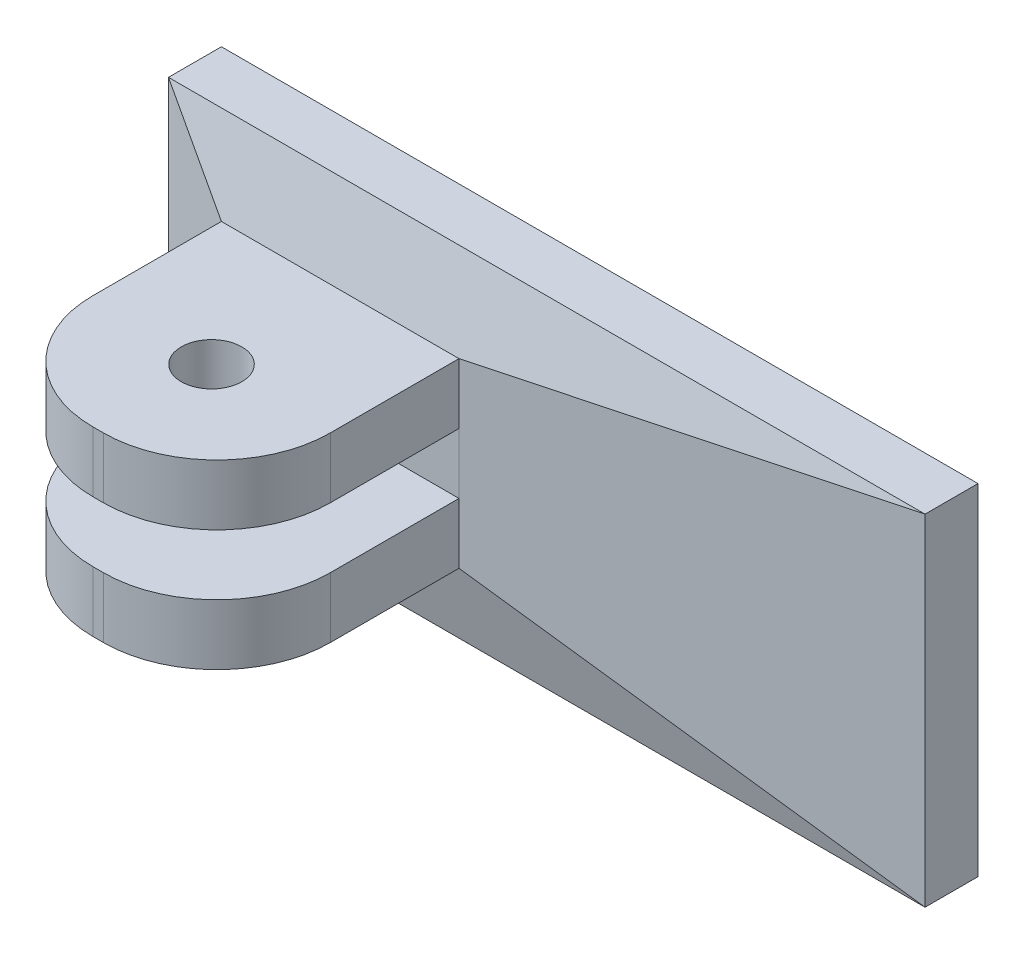
ISO-10303-21;
HEADER;
FILE_DESCRIPTION(('STEP AP214'),'2;1');
FILE_NAME('part.step','',(''),(''),'','','');
FILE_SCHEMA(('AUTOMOTIVE_DESIGN { 1 0 10303 214 1 1 1 1 }'));
ENDSEC;
DATA;
#1=APPLICATION_CONTEXT('core data for automotive mechanical design processes');
#2=APPLICATION_PROTOCOL_DEFINITION('international standard','automotive_design',2000,#1);
#3=PRODUCT_CONTEXT('',#1,'mechanical');
#4=PRODUCT('Part','Part','',(#3));
#5=PRODUCT_RELATED_PRODUCT_CATEGORY('part','',(#4));
#6=PRODUCT_DEFINITION_FORMATION('','',#4);
#7=PRODUCT_DEFINITION_CONTEXT('part definition',#1,'design');
#8=PRODUCT_DEFINITION('design','',#6,#7);
#9=PRODUCT_DEFINITION_SHAPE('','',#8);
#10=(LENGTH_UNIT() NAMED_UNIT(*) SI_UNIT(.MILLI.,.METRE.));
#11=(NAMED_UNIT(*) PLANE_ANGLE_UNIT() SI_UNIT($,.RADIAN.));
#12=(NAMED_UNIT(*) SI_UNIT($,.STERADIAN.) SOLID_ANGLE_UNIT());
#13=UNCERTAINTY_MEASURE_WITH_UNIT(LENGTH_MEASURE(1.E-05),#10,'distance_accuracy_value','');
#14=(GEOMETRIC_REPRESENTATION_CONTEXT(3) GLOBAL_UNCERTAINTY_ASSIGNED_CONTEXT((#13)) GLOBAL_UNIT_ASSIGNED_CONTEXT((#10,
#11,#12)) REPRESENTATION_CONTEXT('',''));
#15=CARTESIAN_POINT('',(0.,0.,0.));
#16=DIRECTION('',(0.,0.,1.));
#17=DIRECTION('',(1.,0.,0.));
#18=AXIS2_PLACEMENT_3D('',#15,#16,#17);
#19=CARTESIAN_POINT('',(0.,0.,10.));
#20=DIRECTION('',(0.,0.,1.));
#21=DIRECTION('',(1.,0.,0.));
#22=AXIS2_PLACEMENT_3D('',#19,#20,#21);
#23=PLANE('',#22);
#24=DIRECTION('',(0.,-1.,0.));
#25=VECTOR('',#24,1.);
#26=CARTESIAN_POINT('',(-13.9499956511895,14.8522318365415,10.));
#27=LINE('',#26,#25);
#28=CARTESIAN_POINT('',(-13.9499956511895,-3.14776816345848,10.));
#29=VERTEX_POINT('',#28);
#30=CARTESIAN_POINT('',(-13.9499956511895,-11.1477681634585,10.));
#31=VERTEX_POINT('',#30);
#32=EDGE_CURVE('E299',#29,#31,#27,.T.);
#33=ORIENTED_EDGE('',*,*,#32,.T.);
#34=DIRECTION('',(1.,0.,0.));
#35=VECTOR('',#34,1.);
#36=CARTESIAN_POINT('',(-13.9499956511895,-11.1477681634585,10.));
#37=LINE('',#36,#35);
#38=CARTESIAN_POINT('',(17.4500043488105,-11.1477681634585,10.));
#39=VERTEX_POINT('',#38);
#40=EDGE_CURVE('E226',#31,#39,#37,.T.);
#41=ORIENTED_EDGE('',*,*,#40,.T.);
#42=DIRECTION('',(0.,-1.,0.));
#43=VECTOR('',#42,1.);
#44=CARTESIAN_POINT('',(17.4500043488105,14.8522318365415,10.));
#45=LINE('',#44,#43);
#46=CARTESIAN_POINT('',(17.4500043488105,-3.14776816345848,10.));
#47=VERTEX_POINT('',#46);
#48=EDGE_CURVE('E56',#47,#39,#45,.T.);
#49=ORIENTED_EDGE('',*,*,#48,.F.);
#50=DIRECTION('',(1.,0.,0.));
#51=VECTOR('',#50,1.);
#52=CARTESIAN_POINT('',(-13.9499956511895,-3.14776816345849,10.));
#53=LINE('',#52,#51);
#54=EDGE_CURVE('E270',#29,#47,#53,.T.);
#55=ORIENTED_EDGE('',*,*,#54,.F.);
#56=EDGE_LOOP('',(#33,#41,#49,#55));
#57=FACE_BOUND('',#56,.T.);
#58=ADVANCED_FACE('F33',(#57),#23,.T.);
#59=CARTESIAN_POINT('',(-23.9499956511895,14.8522318365415,10.));
#60=DIRECTION('',(1.,0.,0.));
#61=DIRECTION('',(0.,1.,0.));
#62=AXIS2_PLACEMENT_3D('',#59,#60,#61);
#63=PLANE('',#62);
#64=DIRECTION('',(0.,0.,-1.));
#65=VECTOR('',#64,1.);
#66=CARTESIAN_POINT('',(-23.9499956511895,-30.1477681634585,10.));
#67=LINE('',#66,#65);
#68=CARTESIAN_POINT('',(-23.9499956511895,-30.1477681634585,7.));
#69=VERTEX_POINT('',#68);
#70=CARTESIAN_POINT('',(-23.9499956511895,-30.1477681634585,0.));
#71=VERTEX_POINT('',#70);
#72=EDGE_CURVE('E180',#69,#71,#67,.T.);
#73=ORIENTED_EDGE('',*,*,#72,.F.);
#74=DIRECTION('',(0.,-1.,0.));
#75=VECTOR('',#74,1.);
#76=CARTESIAN_POINT('',(-23.9499956511895,14.8522318365415,7.));
#77=LINE('',#76,#75);
#78=CARTESIAN_POINT('',(-23.9499956511895,14.8522318365415,7.));
#79=VERTEX_POINT('',#78);
#80=EDGE_CURVE('E172',#79,#69,#77,.T.);
#81=ORIENTED_EDGE('',*,*,#80,.F.);
#82=DIRECTION('',(0.,0.,-1.));
#83=VECTOR('',#82,1.);
#84=CARTESIAN_POINT('',(-23.9499956511895,14.8522318365415,10.));
#85=LINE('',#84,#83);
#86=CARTESIAN_POINT('',(-23.9499956511895,14.8522318365415,0.));
#87=VERTEX_POINT('',#86);
#88=EDGE_CURVE('E163',#79,#87,#85,.T.);
#89=ORIENTED_EDGE('',*,*,#88,.T.);
#90=DIRECTION('',(0.,-1.,0.));
#91=VECTOR('',#90,1.);
#92=CARTESIAN_POINT('',(-23.9499956511895,14.8522318365415,0.));
#93=LINE('',#92,#91);
#94=EDGE_CURVE('E288',#87,#71,#93,.T.);
#95=ORIENTED_EDGE('',*,*,#94,.T.);
#96=EDGE_LOOP('',(#73,#81,#89,#95));
#97=FACE_BOUND('',#96,.T.);
#98=ADVANCED_FACE('F35',(#97),#63,.F.);
#99=CARTESIAN_POINT('',(-23.9499956511895,-30.1477681634585,10.));
#100=DIRECTION('',(0.,1.,0.));
#101=DIRECTION('',(0.,0.,1.));
#102=AXIS2_PLACEMENT_3D('',#99,#100,#101);
#103=PLANE('',#102);
#104=DIRECTION('',(0.,0.,-1.));
#105=VECTOR('',#104,1.);
#106=CARTESIAN_POINT('',(76.0500043488105,-30.1477681634585,10.));
#107=LINE('',#106,#105);
#108=CARTESIAN_POINT('',(76.0500043488105,-30.1477681634585,7.));
#109=VERTEX_POINT('',#108);
#110=CARTESIAN_POINT('',(76.0500043488105,-30.1477681634585,0.));
#111=VERTEX_POINT('',#110);
#112=EDGE_CURVE('E178',#109,#111,#107,.T.);
#113=ORIENTED_EDGE('',*,*,#112,.F.);
#114=DIRECTION('',(-1.,0.,0.));
#115=VECTOR('',#114,1.);
#116=CARTESIAN_POINT('',(76.0500043488105,-30.1477681634585,7.));
#117=LINE('',#116,#115);
#118=EDGE_CURVE('E164',#109,#69,#117,.T.);
#119=ORIENTED_EDGE('',*,*,#118,.T.);
#120=ORIENTED_EDGE('',*,*,#72,.T.);
#121=DIRECTION('',(1.,0.,0.));
#122=VECTOR('',#121,1.);
#123=CARTESIAN_POINT('',(-23.9499956511895,-30.1477681634585,0.));
#124=LINE('',#123,#122);
#125=EDGE_CURVE('E291',#71,#111,#124,.T.);
#126=ORIENTED_EDGE('',*,*,#125,.T.);
#127=EDGE_LOOP('',(#113,#119,#120,#126));
#128=FACE_BOUND('',#127,.T.);
#129=ADVANCED_FACE('F375',(#128),#103,.F.);
#130=CARTESIAN_POINT('',(76.0500043488105,14.8522318365415,10.));
#131=DIRECTION('',(-1.,0.,0.));
#132=DIRECTION('',(0.,-1.,0.));
#133=AXIS2_PLACEMENT_3D('',#130,#131,#132);
#134=PLANE('',#133);
#135=DIRECTION('',(0.,0.,-1.));
#136=VECTOR('',#135,1.);
#137=CARTESIAN_POINT('',(76.0500043488105,14.8522318365415,10.));
#138=LINE('',#137,#136);
#139=CARTESIAN_POINT('',(76.0500043488105,14.8522318365415,7.));
#140=VERTEX_POINT('',#139);
#141=CARTESIAN_POINT('',(76.0500043488105,14.8522318365415,0.));
#142=VERTEX_POINT('',#141);
#143=EDGE_CURVE('E161',#140,#142,#138,.T.);
#144=ORIENTED_EDGE('',*,*,#143,.F.);
#145=DIRECTION('',(0.,-1.,0.));
#146=VECTOR('',#145,1.);
#147=CARTESIAN_POINT('',(76.0500043488105,14.8522318365415,7.));
#148=LINE('',#147,#146);
#149=EDGE_CURVE('E168',#140,#109,#148,.T.);
#150=ORIENTED_EDGE('',*,*,#149,.T.);
#151=ORIENTED_EDGE('',*,*,#112,.T.);
#152=DIRECTION('',(0.,1.,0.));
#153=VECTOR('',#152,1.);
#154=CARTESIAN_POINT('',(76.0500043488105,14.8522318365415,0.));
#155=LINE('',#154,#153);
#156=EDGE_CURVE('E176',#111,#142,#155,.T.);
#157=ORIENTED_EDGE('',*,*,#156,.T.);
#158=EDGE_LOOP('',(#144,#150,#151,#157));
#159=FACE_BOUND('',#158,.T.);
#160=ADVANCED_FACE('F174',(#159),#134,.F.);
#161=CARTESIAN_POINT('',(-23.9499956511895,14.8522318365415,10.));
#162=DIRECTION('',(0.,-1.,0.));
#163=DIRECTION('',(0.,0.,-1.));
#164=AXIS2_PLACEMENT_3D('',#161,#162,#163);
#165=PLANE('',#164);
#166=ORIENTED_EDGE('',*,*,#88,.F.);
#167=DIRECTION('',(-1.,0.,0.));
#168=VECTOR('',#167,1.);
#169=CARTESIAN_POINT('',(76.0500043488105,14.8522318365415,7.));
#170=LINE('',#169,#168);
#171=EDGE_CURVE('E149',#140,#79,#170,.T.);
#172=ORIENTED_EDGE('',*,*,#171,.F.);
#173=ORIENTED_EDGE('',*,*,#143,.T.);
#174=DIRECTION('',(-1.,0.,0.));
#175=VECTOR('',#174,1.);
#176=CARTESIAN_POINT('',(-23.9499956511895,14.8522318365415,0.));
#177=LINE('',#176,#175);
#178=EDGE_CURVE('E182',#142,#87,#177,.T.);
#179=ORIENTED_EDGE('',*,*,#178,.T.);
#180=EDGE_LOOP('',(#166,#172,#173,#179));
#181=FACE_BOUND('',#180,.T.);
#182=ADVANCED_FACE('F158',(#181),#165,.F.);
#183=CARTESIAN_POINT('',(0.,0.,0.));
#184=DIRECTION('',(0.,0.,1.));
#185=DIRECTION('',(1.,0.,0.));
#186=AXIS2_PLACEMENT_3D('',#183,#184,#185);
#187=PLANE('',#186);
#188=ORIENTED_EDGE('',*,*,#94,.F.);
#189=ORIENTED_EDGE('',*,*,#178,.F.);
#190=ORIENTED_EDGE('',*,*,#156,.F.);
#191=ORIENTED_EDGE('',*,*,#125,.F.);
#192=EDGE_LOOP('',(#188,#189,#190,#191));
#193=FACE_BOUND('',#192,.T.);
#194=ADVANCED_FACE('F297',(#193),#187,.F.);
#195=CARTESIAN_POINT('',(-13.9499956511895,4.85223183654151,15.));
#196=DIRECTION('',(1.,0.,0.));
#197=DIRECTION('',(0.,1.,0.));
#198=AXIS2_PLACEMENT_3D('',#195,#196,#197);
#199=PLANE('',#198);
#200=DIRECTION('',(0.,-1.,0.));
#201=VECTOR('',#200,1.);
#202=CARTESIAN_POINT('',(-13.9499956511895,4.85223183654151,10.));
#203=LINE('',#202,#201);
#204=CARTESIAN_POINT('',(-13.9499956511895,4.85223183654151,10.));
#205=VERTEX_POINT('',#204);
#206=EDGE_CURVE('E261',#205,#29,#203,.T.);
#207=ORIENTED_EDGE('',*,*,#206,.T.);
#208=DIRECTION('',(0.,0.,-1.));
#209=VECTOR('',#208,1.);
#210=CARTESIAN_POINT('',(-13.9499956511895,-3.14776816345849,15.));
#211=LINE('',#210,#209);
#212=CARTESIAN_POINT('',(-13.9499956511895,-3.14776816345849,27.));
#213=VERTEX_POINT('',#212);
#214=EDGE_CURVE('E285',#213,#29,#211,.T.);
#215=ORIENTED_EDGE('',*,*,#214,.F.);
#216=DIRECTION('',(0.,-1.,0.));
#217=VECTOR('',#216,1.);
#218=CARTESIAN_POINT('',(-13.9499956511895,4.85223183654151,27.));
#219=LINE('',#218,#217);
#220=CARTESIAN_POINT('',(-13.9499956511895,4.85223183654151,27.));
#221=VERTEX_POINT('',#220);
#222=EDGE_CURVE('E258',#221,#213,#219,.T.);
#223=ORIENTED_EDGE('',*,*,#222,.F.);
#224=DIRECTION('',(0.,0.,-1.));
#225=VECTOR('',#224,1.);
#226=CARTESIAN_POINT('',(-13.9499956511895,4.85223183654151,15.));
#227=LINE('',#226,#225);
#228=EDGE_CURVE('E277',#221,#205,#227,.T.);
#229=ORIENTED_EDGE('',*,*,#228,.T.);
#230=EDGE_LOOP('',(#207,#215,#223,#229));
#231=FACE_BOUND('',#230,.T.);
#232=ADVANCED_FACE('F343',(#231),#199,.F.);
#233=CARTESIAN_POINT('',(-13.9499956511895,-3.14776816345849,15.));
#234=DIRECTION('',(0.,1.,0.));
#235=DIRECTION('',(0.,0.,1.));
#236=AXIS2_PLACEMENT_3D('',#233,#234,#235);
#237=PLANE('',#236);
#238=ORIENTED_EDGE('',*,*,#54,.T.);
#239=DIRECTION('',(0.,0.,-1.));
#240=VECTOR('',#239,1.);
#241=CARTESIAN_POINT('',(17.4500043488105,-3.14776816345849,15.));
#242=LINE('',#241,#240);
#243=CARTESIAN_POINT('',(17.4500043488105,-3.14776816345849,27.));
#244=VERTEX_POINT('',#243);
#245=EDGE_CURVE('E282',#244,#47,#242,.T.);
#246=ORIENTED_EDGE('',*,*,#245,.F.);
#247=CARTESIAN_POINT('',(2.45000434881047,-3.14776816345849,27.));
#248=DIRECTION('',(0.,-1.,0.));
#249=DIRECTION('',(0.,0.,1.));
#250=AXIS2_PLACEMENT_3D('',#247,#248,#249);
#251=CIRCLE('',#250,15.);
#252=CARTESIAN_POINT('',(2.45000434881047,-3.14776816345849,42.));
#253=VERTEX_POINT('',#252);
#254=EDGE_CURVE('E237',#244,#253,#251,.T.);
#255=ORIENTED_EDGE('',*,*,#254,.T.);
#256=DIRECTION('',(-1.,0.,0.));
#257=VECTOR('',#256,1.);
#258=CARTESIAN_POINT('',(1.05000434881047,-3.14776816345849,42.));
#259=LINE('',#258,#257);
#260=CARTESIAN_POINT('',(1.05000434881047,-3.14776816345849,42.));
#261=VERTEX_POINT('',#260);
#262=EDGE_CURVE('E253',#253,#261,#259,.T.);
#263=ORIENTED_EDGE('',*,*,#262,.T.);
#264=CARTESIAN_POINT('',(1.05000434881047,-3.14776816345849,27.));
#265=DIRECTION('',(0.,-1.,0.));
#266=DIRECTION('',(0.,0.,1.));
#267=AXIS2_PLACEMENT_3D('',#264,#265,#266);
#268=CIRCLE('',#267,15.);
#269=EDGE_CURVE('E244',#261,#213,#268,.T.);
#270=ORIENTED_EDGE('',*,*,#269,.T.);
#271=ORIENTED_EDGE('',*,*,#214,.T.);
#272=EDGE_LOOP('',(#238,#246,#255,#263,#270,#271));
#273=FACE_BOUND('',#272,.T.);
#274=CARTESIAN_POINT('',(1.74489016758516,-3.14776816345849,27.));
#275=DIRECTION('',(0.,-1.,0.));
#276=DIRECTION('',(0.,0.,-1.));
#277=AXIS2_PLACEMENT_3D('',#274,#275,#276);
#278=CIRCLE('',#277,4.);
#279=CARTESIAN_POINT('',(1.74489016758516,-3.14776816345849,23.));
#280=VERTEX_POINT('',#279);
#281=EDGE_CURVE('E207',#280,#280,#278,.T.);
#282=ORIENTED_EDGE('',*,*,#281,.F.);
#283=EDGE_LOOP('',(#282));
#284=FACE_BOUND('',#283,.T.);
#285=ADVANCED_FACE('F338',(#273,#284),#237,.F.);
#286=CARTESIAN_POINT('',(17.4500043488105,4.85223183654151,15.));
#287=DIRECTION('',(-1.,0.,0.));
#288=DIRECTION('',(0.,0.,1.));
#289=AXIS2_PLACEMENT_3D('',#286,#287,#288);
#290=PLANE('',#289);
#291=DIRECTION('',(0.,1.,0.));
#292=VECTOR('',#291,1.);
#293=CARTESIAN_POINT('',(17.4500043488105,4.85223183654151,10.));
#294=LINE('',#293,#292);
#295=CARTESIAN_POINT('',(17.4500043488104,4.85223183654151,10.));
#296=VERTEX_POINT('',#295);
#297=EDGE_CURVE('E273',#47,#296,#294,.T.);
#298=ORIENTED_EDGE('',*,*,#297,.T.);
#299=DIRECTION('',(0.,0.,-1.));
#300=VECTOR('',#299,1.);
#301=CARTESIAN_POINT('',(17.4500043488105,4.85223183654151,15.));
#302=LINE('',#301,#300);
#303=CARTESIAN_POINT('',(17.4500043488105,4.85223183654151,27.));
#304=VERTEX_POINT('',#303);
#305=EDGE_CURVE('E280',#304,#296,#302,.T.);
#306=ORIENTED_EDGE('',*,*,#305,.F.);
#307=DIRECTION('',(0.,-1.,0.));
#308=VECTOR('',#307,1.);
#309=CARTESIAN_POINT('',(17.4500043488105,4.85223183654151,27.));
#310=LINE('',#309,#308);
#311=EDGE_CURVE('E250',#304,#244,#310,.T.);
#312=ORIENTED_EDGE('',*,*,#311,.T.);
#313=ORIENTED_EDGE('',*,*,#245,.T.);
#314=EDGE_LOOP('',(#298,#306,#312,#313));
#315=FACE_BOUND('',#314,.T.);
#316=ADVANCED_FACE('F352',(#315),#290,.F.);
#317=CARTESIAN_POINT('',(-13.9499956511895,4.85223183654151,15.));
#318=DIRECTION('',(0.,-1.,0.));
#319=DIRECTION('',(0.,0.,-1.));
#320=AXIS2_PLACEMENT_3D('',#317,#318,#319);
#321=PLANE('',#320);
#322=DIRECTION('',(-1.,0.,0.));
#323=VECTOR('',#322,1.);
#324=CARTESIAN_POINT('',(-13.9499956511895,4.85223183654151,10.));
#325=LINE('',#324,#323);
#326=EDGE_CURVE('E151',#296,#205,#325,.T.);
#327=ORIENTED_EDGE('',*,*,#326,.T.);
#328=ORIENTED_EDGE('',*,*,#228,.F.);
#329=CARTESIAN_POINT('',(1.05000434881047,4.85223183654151,27.));
#330=DIRECTION('',(0.,-1.,0.));
#331=DIRECTION('',(0.,0.,1.));
#332=AXIS2_PLACEMENT_3D('',#329,#330,#331);
#333=CIRCLE('',#332,15.);
#334=CARTESIAN_POINT('',(1.05000434881047,4.85223183654151,42.));
#335=VERTEX_POINT('',#334);
#336=EDGE_CURVE('E247',#335,#221,#333,.T.);
#337=ORIENTED_EDGE('',*,*,#336,.F.);
#338=DIRECTION('',(-1.,0.,0.));
#339=VECTOR('',#338,1.);
#340=CARTESIAN_POINT('',(1.05000434881047,4.85223183654151,42.));
#341=LINE('',#340,#339);
#342=CARTESIAN_POINT('',(2.45000434881047,4.85223183654151,42.));
#343=VERTEX_POINT('',#342);
#344=EDGE_CURVE('E243',#343,#335,#341,.T.);
#345=ORIENTED_EDGE('',*,*,#344,.F.);
#346=CARTESIAN_POINT('',(2.45000434881047,4.85223183654151,27.));
#347=DIRECTION('',(0.,-1.,0.));
#348=DIRECTION('',(0.,0.,1.));
#349=AXIS2_PLACEMENT_3D('',#346,#347,#348);
#350=CIRCLE('',#349,15.);
#351=EDGE_CURVE('E240',#304,#343,#350,.T.);
#352=ORIENTED_EDGE('',*,*,#351,.F.);
#353=ORIENTED_EDGE('',*,*,#305,.T.);
#354=EDGE_LOOP('',(#327,#328,#337,#345,#352,#353));
#355=FACE_BOUND('',#354,.T.);
#356=CARTESIAN_POINT('',(1.74489016758516,4.85223183654151,27.));
#357=DIRECTION('',(0.,-1.,0.));
#358=DIRECTION('',(0.,0.,-1.));
#359=AXIS2_PLACEMENT_3D('',#356,#357,#358);
#360=CIRCLE('',#359,4.);
#361=CARTESIAN_POINT('',(1.74489016758516,4.85223183654151,23.));
#362=VERTEX_POINT('',#361);
#363=EDGE_CURVE('E234',#362,#362,#360,.T.);
#364=ORIENTED_EDGE('',*,*,#363,.T.);
#365=EDGE_LOOP('',(#364));
#366=FACE_BOUND('',#365,.T.);
#367=ADVANCED_FACE('F346',(#355,#366),#321,.F.);
#368=CARTESIAN_POINT('',(1.05000434881047,4.85223183654151,27.));
#369=DIRECTION('',(0.,-1.,0.));
#370=DIRECTION('',(0.,0.,-1.));
#371=AXIS2_PLACEMENT_3D('',#368,#369,#370);
#372=CYLINDRICAL_SURFACE('',#371,15.);
#373=ORIENTED_EDGE('',*,*,#269,.F.);
#374=DIRECTION('',(0.,-1.,0.));
#375=VECTOR('',#374,1.);
#376=CARTESIAN_POINT('',(1.05000434881047,4.85223183654151,42.));
#377=LINE('',#376,#375);
#378=EDGE_CURVE('E262',#335,#261,#377,.T.);
#379=ORIENTED_EDGE('',*,*,#378,.F.);
#380=ORIENTED_EDGE('',*,*,#336,.T.);
#381=ORIENTED_EDGE('',*,*,#222,.T.);
#382=EDGE_LOOP('',(#373,#379,#380,#381));
#383=FACE_BOUND('',#382,.T.);
#384=ADVANCED_FACE('F360',(#383),#372,.T.);
#385=CARTESIAN_POINT('',(1.05000434881047,4.85223183654151,42.));
#386=DIRECTION('',(0.,0.,1.));
#387=DIRECTION('',(1.,0.,0.));
#388=AXIS2_PLACEMENT_3D('',#385,#386,#387);
#389=PLANE('',#388);
#390=ORIENTED_EDGE('',*,*,#262,.F.);
#391=DIRECTION('',(0.,-1.,0.));
#392=VECTOR('',#391,1.);
#393=CARTESIAN_POINT('',(2.45000434881047,4.85223183654151,42.));
#394=LINE('',#393,#392);
#395=EDGE_CURVE('E264',#343,#253,#394,.T.);
#396=ORIENTED_EDGE('',*,*,#395,.F.);
#397=ORIENTED_EDGE('',*,*,#344,.T.);
#398=ORIENTED_EDGE('',*,*,#378,.T.);
#399=EDGE_LOOP('',(#390,#396,#397,#398));
#400=FACE_BOUND('',#399,.T.);
#401=ADVANCED_FACE('F358',(#400),#389,.T.);
#402=CARTESIAN_POINT('',(2.45000434881047,4.85223183654151,27.));
#403=DIRECTION('',(0.,-1.,0.));
#404=DIRECTION('',(0.,0.,-1.));
#405=AXIS2_PLACEMENT_3D('',#402,#403,#404);
#406=CYLINDRICAL_SURFACE('',#405,15.);
#407=ORIENTED_EDGE('',*,*,#254,.F.);
#408=ORIENTED_EDGE('',*,*,#311,.F.);
#409=ORIENTED_EDGE('',*,*,#351,.T.);
#410=ORIENTED_EDGE('',*,*,#395,.T.);
#411=EDGE_LOOP('',(#407,#408,#409,#410));
#412=FACE_BOUND('',#411,.T.);
#413=ADVANCED_FACE('F356',(#412),#406,.T.);
#414=CARTESIAN_POINT('',(1.74489016758516,4.85223183654151,27.));
#415=DIRECTION('',(0.,-1.,0.));
#416=DIRECTION('',(0.,0.,-1.));
#417=AXIS2_PLACEMENT_3D('',#414,#415,#416);
#418=CYLINDRICAL_SURFACE('',#417,4.);
#419=ORIENTED_EDGE('',*,*,#363,.F.);
#420=EDGE_LOOP('',(#419));
#421=FACE_BOUND('',#420,.T.);
#422=ORIENTED_EDGE('',*,*,#281,.T.);
#423=EDGE_LOOP('',(#422));
#424=FACE_BOUND('',#423,.T.);
#425=ADVANCED_FACE('F419',(#421,#424),#418,.F.);
#426=CARTESIAN_POINT('',(-13.9499956511895,-19.1477681634585,15.));
#427=DIRECTION('',(-1.,0.,0.));
#428=DIRECTION('',(0.,-1.,0.));
#429=AXIS2_PLACEMENT_3D('',#426,#427,#428);
#430=PLANE('',#429);
#431=DIRECTION('',(0.,1.,0.));
#432=VECTOR('',#431,1.);
#433=CARTESIAN_POINT('',(-13.9499956511895,-19.1477681634585,10.));
#434=LINE('',#433,#432);
#435=CARTESIAN_POINT('',(-13.9499956511895,-19.1477681634585,10.));
#436=VERTEX_POINT('',#435);
#437=EDGE_CURVE('E192',#436,#31,#434,.T.);
#438=ORIENTED_EDGE('',*,*,#437,.F.);
#439=DIRECTION('',(0.,0.,-1.));
#440=VECTOR('',#439,1.);
#441=CARTESIAN_POINT('',(-13.9499956511895,-19.1477681634585,15.));
#442=LINE('',#441,#440);
#443=CARTESIAN_POINT('',(-13.9499956511895,-19.1477681634585,27.));
#444=VERTEX_POINT('',#443);
#445=EDGE_CURVE('E199',#444,#436,#442,.T.);
#446=ORIENTED_EDGE('',*,*,#445,.F.);
#447=DIRECTION('',(0.,1.,0.));
#448=VECTOR('',#447,1.);
#449=CARTESIAN_POINT('',(-13.9499956511895,-19.1477681634585,27.));
#450=LINE('',#449,#448);
#451=CARTESIAN_POINT('',(-13.9499956511895,-11.1477681634585,27.));
#452=VERTEX_POINT('',#451);
#453=EDGE_CURVE('E222',#444,#452,#450,.T.);
#454=ORIENTED_EDGE('',*,*,#453,.T.);
#455=DIRECTION('',(0.,0.,-1.));
#456=VECTOR('',#455,1.);
#457=CARTESIAN_POINT('',(-13.9499956511895,-11.1477681634585,15.));
#458=LINE('',#457,#456);
#459=EDGE_CURVE('E212',#452,#31,#458,.T.);
#460=ORIENTED_EDGE('',*,*,#459,.T.);
#461=EDGE_LOOP('',(#438,#446,#454,#460));
#462=FACE_BOUND('',#461,.T.);
#463=ADVANCED_FACE('F211',(#462),#430,.T.);
#464=CARTESIAN_POINT('',(-13.9499956511895,-19.1477681634585,15.));
#465=DIRECTION('',(0.,-1.,0.));
#466=DIRECTION('',(0.,0.,-1.));
#467=AXIS2_PLACEMENT_3D('',#464,#465,#466);
#468=PLANE('',#467);
#469=DIRECTION('',(-1.,0.,0.));
#470=VECTOR('',#469,1.);
#471=CARTESIAN_POINT('',(-13.9499956511895,-19.1477681634585,10.));
#472=LINE('',#471,#470);
#473=CARTESIAN_POINT('',(17.4500043488111,-19.1477681634585,9.99999999999998));
#474=VERTEX_POINT('',#473);
#475=EDGE_CURVE('E48',#474,#436,#472,.T.);
#476=ORIENTED_EDGE('',*,*,#475,.F.);
#477=DIRECTION('',(0.,0.,-1.));
#478=VECTOR('',#477,1.);
#479=CARTESIAN_POINT('',(17.4500043488105,-19.1477681634585,15.));
#480=LINE('',#479,#478);
#481=CARTESIAN_POINT('',(17.4500043488105,-19.1477681634585,27.));
#482=VERTEX_POINT('',#481);
#483=EDGE_CURVE('E208',#482,#474,#480,.T.);
#484=ORIENTED_EDGE('',*,*,#483,.F.);
#485=CARTESIAN_POINT('',(2.45000434881047,-19.1477681634585,27.));
#486=DIRECTION('',(0.,-1.,0.));
#487=DIRECTION('',(0.,0.,1.));
#488=AXIS2_PLACEMENT_3D('',#485,#486,#487);
#489=CIRCLE('',#488,15.);
#490=CARTESIAN_POINT('',(2.45000434881047,-19.1477681634585,42.));
#491=VERTEX_POINT('',#490);
#492=EDGE_CURVE('E315',#482,#491,#489,.T.);
#493=ORIENTED_EDGE('',*,*,#492,.T.);
#494=DIRECTION('',(-1.,0.,0.));
#495=VECTOR('',#494,1.);
#496=CARTESIAN_POINT('',(1.05000434881047,-19.1477681634585,42.));
#497=LINE('',#496,#495);
#498=CARTESIAN_POINT('',(1.05000434881047,-19.1477681634585,42.));
#499=VERTEX_POINT('',#498);
#500=EDGE_CURVE('E312',#491,#499,#497,.T.);
#501=ORIENTED_EDGE('',*,*,#500,.T.);
#502=CARTESIAN_POINT('',(1.05000434881047,-19.1477681634585,27.));
#503=DIRECTION('',(0.,-1.,0.));
#504=DIRECTION('',(0.,0.,1.));
#505=AXIS2_PLACEMENT_3D('',#502,#503,#504);
#506=CIRCLE('',#505,15.);
#507=EDGE_CURVE('E203',#499,#444,#506,.T.);
#508=ORIENTED_EDGE('',*,*,#507,.T.);
#509=ORIENTED_EDGE('',*,*,#445,.T.);
#510=EDGE_LOOP('',(#476,#484,#493,#501,#508,#509));
#511=FACE_BOUND('',#510,.T.);
#512=CARTESIAN_POINT('',(1.74489016758516,-19.1477681634585,27.));
#513=DIRECTION('',(0.,-1.,0.));
#514=DIRECTION('',(0.,0.,-1.));
#515=AXIS2_PLACEMENT_3D('',#512,#513,#514);
#516=CIRCLE('',#515,4.);
#517=CARTESIAN_POINT('',(1.74489016758516,-19.1477681634585,23.));
#518=VERTEX_POINT('',#517);
#519=EDGE_CURVE('E305',#518,#518,#516,.T.);
#520=ORIENTED_EDGE('',*,*,#519,.F.);
#521=EDGE_LOOP('',(#520));
#522=FACE_BOUND('',#521,.T.);
#523=ADVANCED_FACE('F200',(#511,#522),#468,.T.);
#524=CARTESIAN_POINT('',(17.4500043488105,-19.1477681634585,15.));
#525=DIRECTION('',(1.,0.,0.));
#526=DIRECTION('',(0.,0.,-1.));
#527=AXIS2_PLACEMENT_3D('',#524,#525,#526);
#528=PLANE('',#527);
#529=DIRECTION('',(0.,-1.,0.));
#530=VECTOR('',#529,1.);
#531=CARTESIAN_POINT('',(17.4500043488105,-19.1477681634585,10.));
#532=LINE('',#531,#530);
#533=EDGE_CURVE('E216',#39,#474,#532,.T.);
#534=ORIENTED_EDGE('',*,*,#533,.F.);
#535=DIRECTION('',(0.,0.,-1.));
#536=VECTOR('',#535,1.);
#537=CARTESIAN_POINT('',(17.4500043488105,-11.1477681634585,15.));
#538=LINE('',#537,#536);
#539=CARTESIAN_POINT('',(17.4500043488105,-11.1477681634585,27.));
#540=VERTEX_POINT('',#539);
#541=EDGE_CURVE('E229',#540,#39,#538,.T.);
#542=ORIENTED_EDGE('',*,*,#541,.F.);
#543=DIRECTION('',(0.,1.,0.));
#544=VECTOR('',#543,1.);
#545=CARTESIAN_POINT('',(17.4500043488105,-19.1477681634585,27.));
#546=LINE('',#545,#544);
#547=EDGE_CURVE('E214',#482,#540,#546,.T.);
#548=ORIENTED_EDGE('',*,*,#547,.F.);
#549=ORIENTED_EDGE('',*,*,#483,.T.);
#550=EDGE_LOOP('',(#534,#542,#548,#549));
#551=FACE_BOUND('',#550,.T.);
#552=ADVANCED_FACE('F393',(#551),#528,.T.);
#553=CARTESIAN_POINT('',(-13.9499956511895,-11.1477681634585,15.));
#554=DIRECTION('',(0.,1.,0.));
#555=DIRECTION('',(0.,0.,1.));
#556=AXIS2_PLACEMENT_3D('',#553,#554,#555);
#557=PLANE('',#556);
#558=ORIENTED_EDGE('',*,*,#40,.F.);
#559=ORIENTED_EDGE('',*,*,#459,.F.);
#560=CARTESIAN_POINT('',(1.05000434881047,-11.1477681634585,27.));
#561=DIRECTION('',(0.,-1.,0.));
#562=DIRECTION('',(0.,0.,1.));
#563=AXIS2_PLACEMENT_3D('',#560,#561,#562);
#564=CIRCLE('',#563,15.);
#565=CARTESIAN_POINT('',(1.05000434881047,-11.1477681634585,42.));
#566=VERTEX_POINT('',#565);
#567=EDGE_CURVE('E308',#566,#452,#564,.T.);
#568=ORIENTED_EDGE('',*,*,#567,.F.);
#569=DIRECTION('',(-1.,0.,0.));
#570=VECTOR('',#569,1.);
#571=CARTESIAN_POINT('',(1.05000434881047,-11.1477681634585,42.));
#572=LINE('',#571,#570);
#573=CARTESIAN_POINT('',(2.45000434881047,-11.1477681634585,42.));
#574=VERTEX_POINT('',#573);
#575=EDGE_CURVE('E319',#574,#566,#572,.T.);
#576=ORIENTED_EDGE('',*,*,#575,.F.);
#577=CARTESIAN_POINT('',(2.45000434881047,-11.1477681634585,27.));
#578=DIRECTION('',(0.,-1.,0.));
#579=DIRECTION('',(0.,0.,1.));
#580=AXIS2_PLACEMENT_3D('',#577,#578,#579);
#581=CIRCLE('',#580,15.);
#582=EDGE_CURVE('E313',#540,#574,#581,.T.);
#583=ORIENTED_EDGE('',*,*,#582,.F.);
#584=ORIENTED_EDGE('',*,*,#541,.T.);
#585=EDGE_LOOP('',(#558,#559,#568,#576,#583,#584));
#586=FACE_BOUND('',#585,.T.);
#587=CARTESIAN_POINT('',(1.74489016758516,-11.1477681634585,27.));
#588=DIRECTION('',(0.,-1.,0.));
#589=DIRECTION('',(0.,0.,-1.));
#590=AXIS2_PLACEMENT_3D('',#587,#588,#589);
#591=CIRCLE('',#590,4.);
#592=CARTESIAN_POINT('',(1.74489016758516,-11.1477681634585,23.));
#593=VERTEX_POINT('',#592);
#594=EDGE_CURVE('E301',#593,#593,#591,.T.);
#595=ORIENTED_EDGE('',*,*,#594,.T.);
#596=EDGE_LOOP('',(#595));
#597=FACE_BOUND('',#596,.T.);
#598=ADVANCED_FACE('F331',(#586,#597),#557,.T.);
#599=CARTESIAN_POINT('',(2.45000434881047,-19.1477681634585,27.));
#600=DIRECTION('',(0.,1.,0.));
#601=DIRECTION('',(0.,0.,1.));
#602=AXIS2_PLACEMENT_3D('',#599,#600,#601);
#603=CYLINDRICAL_SURFACE('',#602,15.);
#604=ORIENTED_EDGE('',*,*,#582,.T.);
#605=DIRECTION('',(0.,1.,0.));
#606=VECTOR('',#605,1.);
#607=CARTESIAN_POINT('',(2.45000434881047,-19.1477681634585,42.));
#608=LINE('',#607,#606);
#609=EDGE_CURVE('E219',#491,#574,#608,.T.);
#610=ORIENTED_EDGE('',*,*,#609,.F.);
#611=ORIENTED_EDGE('',*,*,#492,.F.);
#612=ORIENTED_EDGE('',*,*,#547,.T.);
#613=EDGE_LOOP('',(#604,#610,#611,#612));
#614=FACE_BOUND('',#613,.T.);
#615=ADVANCED_FACE('F398',(#614),#603,.T.);
#616=CARTESIAN_POINT('',(1.05000434881047,-19.1477681634585,42.));
#617=DIRECTION('',(0.,0.,-1.));
#618=DIRECTION('',(-1.,0.,0.));
#619=AXIS2_PLACEMENT_3D('',#616,#617,#618);
#620=PLANE('',#619);
#621=ORIENTED_EDGE('',*,*,#575,.T.);
#622=DIRECTION('',(0.,1.,0.));
#623=VECTOR('',#622,1.);
#624=CARTESIAN_POINT('',(1.05000434881047,-19.1477681634585,42.));
#625=LINE('',#624,#623);
#626=EDGE_CURVE('E323',#499,#566,#625,.T.);
#627=ORIENTED_EDGE('',*,*,#626,.F.);
#628=ORIENTED_EDGE('',*,*,#500,.F.);
#629=ORIENTED_EDGE('',*,*,#609,.T.);
#630=EDGE_LOOP('',(#621,#627,#628,#629));
#631=FACE_BOUND('',#630,.T.);
#632=ADVANCED_FACE('F400',(#631),#620,.F.);
#633=CARTESIAN_POINT('',(1.05000434881047,-19.1477681634585,27.));
#634=DIRECTION('',(0.,1.,0.));
#635=DIRECTION('',(0.,0.,1.));
#636=AXIS2_PLACEMENT_3D('',#633,#634,#635);
#637=CYLINDRICAL_SURFACE('',#636,15.);
#638=ORIENTED_EDGE('',*,*,#567,.T.);
#639=ORIENTED_EDGE('',*,*,#453,.F.);
#640=ORIENTED_EDGE('',*,*,#507,.F.);
#641=ORIENTED_EDGE('',*,*,#626,.T.);
#642=EDGE_LOOP('',(#638,#639,#640,#641));
#643=FACE_BOUND('',#642,.T.);
#644=ADVANCED_FACE('F328',(#643),#637,.T.);
#645=CARTESIAN_POINT('',(1.74489016758516,-19.1477681634585,27.));
#646=DIRECTION('',(0.,1.,0.));
#647=DIRECTION('',(0.,0.,1.));
#648=AXIS2_PLACEMENT_3D('',#645,#646,#647);
#649=CYLINDRICAL_SURFACE('',#648,4.);
#650=ORIENTED_EDGE('',*,*,#519,.T.);
#651=EDGE_LOOP('',(#650));
#652=FACE_BOUND('',#651,.T.);
#653=ORIENTED_EDGE('',*,*,#594,.F.);
#654=EDGE_LOOP('',(#653));
#655=FACE_BOUND('',#654,.T.);
#656=ADVANCED_FACE('F407',(#652,#655),#649,.F.);
#657=CARTESIAN_POINT('',(17.4500043488105,14.8522318365415,10.));
#658=DIRECTION('',(-0.0511275834390955,0.,-0.998692129843666));
#659=DIRECTION('',(-0.998692129843666,0.,0.0511275834390955));
#660=AXIS2_PLACEMENT_3D('',#657,#658,#659);
#661=PLANE('',#660);
#662=ORIENTED_EDGE('',*,*,#149,.F.);
#663=DIRECTION('',(-0.984497213887377,-0.168002937523443,0.050400881257033));
#664=VECTOR('',#663,1.);
#665=CARTESIAN_POINT('',(19.1039885879777,5.13448170670658,9.91532503895048));
#666=LINE('',#665,#664);
#667=EDGE_CURVE('E146',#140,#296,#666,.T.);
#668=ORIENTED_EDGE('',*,*,#667,.T.);
#669=ORIENTED_EDGE('',*,*,#297,.F.);
#670=ORIENTED_EDGE('',*,*,#48,.T.);
#671=ORIENTED_EDGE('',*,*,#533,.T.);
#672=DIRECTION('',(0.981592441293711,-0.184257966795747,-0.0502521727624767));
#673=VECTOR('',#672,1.);
#674=CARTESIAN_POINT('',(11.3005526153455,-17.9934342203166,10.3148183481296));
#675=LINE('',#674,#673);
#676=EDGE_CURVE('E154',#474,#109,#675,.T.);
#677=ORIENTED_EDGE('',*,*,#676,.T.);
#678=EDGE_LOOP('',(#662,#668,#669,#670,#671,#677));
#679=FACE_BOUND('',#678,.T.);
#680=ADVANCED_FACE('F169',(#679),#661,.F.);
#681=CARTESIAN_POINT('',(-13.9499956511895,14.8522318365415,10.));
#682=DIRECTION('',(0.287347885566346,0.,-0.957826285221151));
#683=DIRECTION('',(-0.957826285221151,0.,-0.287347885566346));
#684=AXIS2_PLACEMENT_3D('',#681,#682,#683);
#685=PLANE('',#684);
#686=ORIENTED_EDGE('',*,*,#206,.F.);
#687=DIRECTION('',(-0.691714463866074,0.691714463866075,-0.207514339159823));
#688=VECTOR('',#687,1.);
#689=CARTESIAN_POINT('',(-18.7346846464048,9.63692083175683,8.56459330143541));
#690=LINE('',#689,#688);
#691=EDGE_CURVE('E11',#205,#79,#690,.T.);
#692=ORIENTED_EDGE('',*,*,#691,.T.);
#693=ORIENTED_EDGE('',*,*,#80,.T.);
#694=DIRECTION('',(0.659380473395787,0.725318520735366,0.197814142018736));
#695=VECTOR('',#694,1.);
#696=CARTESIAN_POINT('',(2.31087391402786,-1.26081164171934,14.8782608695652));
#697=LINE('',#696,#695);
#698=EDGE_CURVE('E41',#69,#436,#697,.T.);
#699=ORIENTED_EDGE('',*,*,#698,.T.);
#700=ORIENTED_EDGE('',*,*,#437,.T.);
#701=ORIENTED_EDGE('',*,*,#32,.F.);
#702=EDGE_LOOP('',(#686,#692,#693,#699,#700,#701));
#703=FACE_BOUND('',#702,.T.);
#704=ADVANCED_FACE('F190',(#703),#685,.F.);
#705=CARTESIAN_POINT('',(76.0500043488105,-19.1477681634585,10.));
#706=DIRECTION('',(0.,0.263117405792109,-0.964763821237732));
#707=DIRECTION('',(0.,0.964763821237732,0.263117405792109));
#708=AXIS2_PLACEMENT_3D('',#705,#706,#707);
#709=PLANE('',#708);
#710=ORIENTED_EDGE('',*,*,#475,.T.);
#711=ORIENTED_EDGE('',*,*,#698,.F.);
#712=ORIENTED_EDGE('',*,*,#118,.F.);
#713=ORIENTED_EDGE('',*,*,#676,.F.);
#714=EDGE_LOOP('',(#710,#711,#712,#713));
#715=FACE_BOUND('',#714,.T.);
#716=ADVANCED_FACE('F390',(#715),#709,.F.);
#717=CARTESIAN_POINT('',(76.0500043488105,14.8522318365415,7.));
#718=DIRECTION('',(0.,-0.287347885566345,-0.957826285221151));
#719=DIRECTION('',(0.,0.957826285221151,-0.287347885566345));
#720=AXIS2_PLACEMENT_3D('',#717,#718,#719);
#721=PLANE('',#720);
#722=ORIENTED_EDGE('',*,*,#171,.T.);
#723=ORIENTED_EDGE('',*,*,#691,.F.);
#724=ORIENTED_EDGE('',*,*,#326,.F.);
#725=ORIENTED_EDGE('',*,*,#667,.F.);
#726=EDGE_LOOP('',(#722,#723,#724,#725));
#727=FACE_BOUND('',#726,.T.);
#728=ADVANCED_FACE('F148',(#727),#721,.F.);
#729=CLOSED_SHELL('',(#58,#98,#129,#160,#182,#194,#232,#285,#316,#367,#384,#401,#413,#425,#463,
#523,#552,#598,#615,#632,#644,#656,#680,#704,#716,#728));
#730=MANIFOLD_SOLID_BREP('B2',#729);
#731=ADVANCED_BREP_SHAPE_REPRESENTATION('',(#18,#730),#14);
#732=SHAPE_DEFINITION_REPRESENTATION(#9,#731);
ENDSEC;
END-ISO-10303-21;
